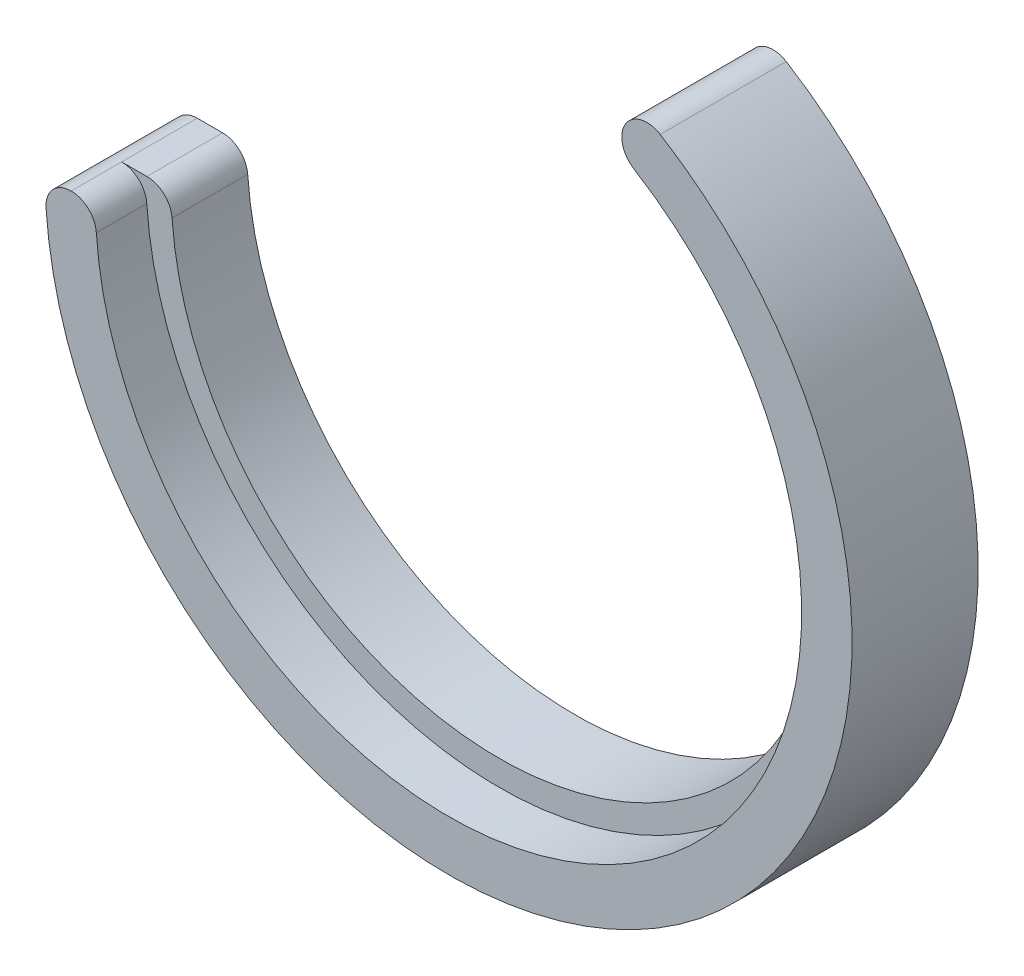
ISO-10303-21;
HEADER;
FILE_DESCRIPTION(('STEP AP214'),'2;1');
FILE_NAME('part.step','',(''),(''),'','','');
FILE_SCHEMA(('AUTOMOTIVE_DESIGN { 1 0 10303 214 1 1 1 1 }'));
ENDSEC;
DATA;
#1=APPLICATION_CONTEXT('core data for automotive mechanical design processes');
#2=APPLICATION_PROTOCOL_DEFINITION('international standard','automotive_design',2000,#1);
#3=PRODUCT_CONTEXT('',#1,'mechanical');
#4=PRODUCT('Part','Part','',(#3));
#5=PRODUCT_RELATED_PRODUCT_CATEGORY('part','',(#4));
#6=PRODUCT_DEFINITION_FORMATION('','',#4);
#7=PRODUCT_DEFINITION_CONTEXT('part definition',#1,'design');
#8=PRODUCT_DEFINITION('design','',#6,#7);
#9=PRODUCT_DEFINITION_SHAPE('','',#8);
#10=(LENGTH_UNIT() NAMED_UNIT(*) SI_UNIT(.MILLI.,.METRE.));
#11=(NAMED_UNIT(*) PLANE_ANGLE_UNIT() SI_UNIT($,.RADIAN.));
#12=(NAMED_UNIT(*) SI_UNIT($,.STERADIAN.) SOLID_ANGLE_UNIT());
#13=UNCERTAINTY_MEASURE_WITH_UNIT(LENGTH_MEASURE(1.E-05),#10,'distance_accuracy_value','');
#14=(GEOMETRIC_REPRESENTATION_CONTEXT(3) GLOBAL_UNCERTAINTY_ASSIGNED_CONTEXT((#13)) GLOBAL_UNIT_ASSIGNED_CONTEXT((#10,
#11,#12)) REPRESENTATION_CONTEXT('',''));
#15=CARTESIAN_POINT('',(0.,0.,0.));
#16=DIRECTION('',(0.,0.,1.));
#17=DIRECTION('',(1.,0.,0.));
#18=AXIS2_PLACEMENT_3D('',#15,#16,#17);
#19=CARTESIAN_POINT('',(0.,0.,1.5));
#20=DIRECTION('',(0.,0.,-1.));
#21=DIRECTION('',(-1.,0.,0.));
#22=AXIS2_PLACEMENT_3D('',#19,#20,#21);
#23=PLANE('',#22);
#24=CARTESIAN_POINT('',(0.,0.,1.5));
#25=DIRECTION('',(0.,0.,-1.));
#26=DIRECTION('',(-1.,0.,0.));
#27=AXIS2_PLACEMENT_3D('',#24,#25,#26);
#28=CIRCLE('',#27,6.5);
#29=CARTESIAN_POINT('',(3.43588156657079,5.51767322886188,1.5));
#30=VERTEX_POINT('',#29);
#31=CARTESIAN_POINT('',(-6.48339716317844,-0.464285714285714,1.5));
#32=VERTEX_POINT('',#31);
#33=EDGE_CURVE('E157',#30,#32,#28,.T.);
#34=ORIENTED_EDGE('',*,*,#33,.T.);
#35=CARTESIAN_POINT('',(-6.98212002188447,-0.5,1.5));
#36=DIRECTION('',(0.,0.,-1.));
#37=DIRECTION('',(-1.,0.,0.));
#38=AXIS2_PLACEMENT_3D('',#35,#36,#37);
#39=CIRCLE('',#38,0.5);
#40=CARTESIAN_POINT('',(-6.98212002188447,0.,1.5));
#41=VERTEX_POINT('',#40);
#42=EDGE_CURVE('E179',#32,#41,#39,.F.);
#43=ORIENTED_EDGE('',*,*,#42,.T.);
#44=DIRECTION('',(-1.,0.,0.));
#45=VECTOR('',#44,1.);
#46=CARTESIAN_POINT('',(-8.,0.,1.5));
#47=LINE('',#46,#45);
#48=CARTESIAN_POINT('',(-7.48331477354788,0.,1.5));
#49=VERTEX_POINT('',#48);
#50=EDGE_CURVE('E138',#41,#49,#47,.T.);
#51=ORIENTED_EDGE('',*,*,#50,.T.);
#52=CARTESIAN_POINT('',(-7.48331477354788,-0.499999999999999,1.5));
#53=DIRECTION('',(0.,0.,-1.));
#54=DIRECTION('',(-1.,0.,0.));
#55=AXIS2_PLACEMENT_3D('',#52,#53,#54);
#56=CIRCLE('',#55,0.5);
#57=CARTESIAN_POINT('',(-6.98442712197803,-0.466666666666666,1.5));
#58=VERTEX_POINT('',#57);
#59=EDGE_CURVE('E42',#49,#58,#56,.T.);
#60=ORIENTED_EDGE('',*,*,#59,.T.);
#61=CARTESIAN_POINT('',(0.,0.,1.5));
#62=DIRECTION('',(0.,0.,-1.));
#63=DIRECTION('',(-1.,0.,0.));
#64=AXIS2_PLACEMENT_3D('',#61,#62,#63);
#65=CIRCLE('',#64,7.);
#66=CARTESIAN_POINT('',(3.67177462252853,5.95970394578082,1.5));
#67=VERTEX_POINT('',#66);
#68=EDGE_CURVE('E170',#67,#58,#65,.T.);
#69=ORIENTED_EDGE('',*,*,#68,.F.);
#70=CARTESIAN_POINT('',(3.93404423842342,6.38539708476517,1.5));
#71=DIRECTION('',(0.,0.,-1.));
#72=DIRECTION('',(-1.,0.,0.));
#73=AXIS2_PLACEMENT_3D('',#70,#71,#72);
#74=CIRCLE('',#73,0.5);
#75=CARTESIAN_POINT('',(3.49181349656916,6.61870368767008,1.5));
#76=VERTEX_POINT('',#75);
#77=EDGE_CURVE('E11',#67,#76,#74,.T.);
#78=ORIENTED_EDGE('',*,*,#77,.T.);
#79=DIRECTION('',(-0.466613205809819,-0.884461483708524,0.));
#80=VECTOR('',#79,1.);
#81=CARTESIAN_POINT('',(3.73290564647855,7.07569186966819,1.5));
#82=LINE('',#81,#80);
#83=CARTESIAN_POINT('',(3.25794940676044,6.17541623398693,1.5));
#84=VERTEX_POINT('',#83);
#85=EDGE_CURVE('E50',#76,#84,#82,.T.);
#86=ORIENTED_EDGE('',*,*,#85,.T.);
#87=CARTESIAN_POINT('',(3.7001801486147,5.94210963108202,1.5));
#88=DIRECTION('',(0.,0.,-1.));
#89=DIRECTION('',(-1.,0.,0.));
#90=AXIS2_PLACEMENT_3D('',#87,#88,#89);
#91=CIRCLE('',#90,0.5);
#92=EDGE_CURVE('E177',#84,#30,#91,.F.);
#93=ORIENTED_EDGE('',*,*,#92,.T.);
#94=EDGE_LOOP('',(#34,#43,#51,#60,#69,#78,#86,#93));
#95=FACE_BOUND('',#94,.T.);
#96=ADVANCED_FACE('F33',(#95),#23,.F.);
#97=CARTESIAN_POINT('',(0.,0.,1.5));
#98=DIRECTION('',(0.,0.,-1.));
#99=DIRECTION('',(-1.,0.,0.));
#100=AXIS2_PLACEMENT_3D('',#97,#98,#99);
#101=CYLINDRICAL_SURFACE('',#100,6.5);
#102=CARTESIAN_POINT('',(0.,0.,0.));
#103=DIRECTION('',(0.,0.,-1.));
#104=DIRECTION('',(-1.,0.,0.));
#105=AXIS2_PLACEMENT_3D('',#102,#103,#104);
#106=CIRCLE('',#105,6.5);
#107=CARTESIAN_POINT('',(3.43588156657079,5.51767322886188,0.));
#108=VERTEX_POINT('',#107);
#109=CARTESIAN_POINT('',(-6.48339716317844,-0.464285714285714,0.));
#110=VERTEX_POINT('',#109);
#111=EDGE_CURVE('E146',#108,#110,#106,.T.);
#112=ORIENTED_EDGE('',*,*,#111,.T.);
#113=DIRECTION('',(0.,0.,-1.));
#114=VECTOR('',#113,1.);
#115=CARTESIAN_POINT('',(-6.48339716317844,-0.464285714285714,1.5));
#116=LINE('',#115,#114);
#117=EDGE_CURVE('E123',#110,#32,#116,.F.);
#118=ORIENTED_EDGE('',*,*,#117,.T.);
#119=ORIENTED_EDGE('',*,*,#33,.F.);
#120=DIRECTION('',(0.,0.,-1.));
#121=VECTOR('',#120,1.);
#122=CARTESIAN_POINT('',(3.43588156657079,5.51767322886188,1.5));
#123=LINE('',#122,#121);
#124=EDGE_CURVE('E128',#30,#108,#123,.T.);
#125=ORIENTED_EDGE('',*,*,#124,.T.);
#126=EDGE_LOOP('',(#112,#118,#119,#125));
#127=FACE_BOUND('',#126,.T.);
#128=ADVANCED_FACE('F228',(#127),#101,.F.);
#129=CARTESIAN_POINT('',(-8.,0.,1.5));
#130=DIRECTION('',(0.,-1.,0.));
#131=DIRECTION('',(1.,0.,0.));
#132=AXIS2_PLACEMENT_3D('',#129,#130,#131);
#133=PLANE('',#132);
#134=ORIENTED_EDGE('',*,*,#50,.F.);
#135=DIRECTION('',(0.,0.,-1.));
#136=VECTOR('',#135,1.);
#137=CARTESIAN_POINT('',(-6.98212002188447,0.,1.5));
#138=LINE('',#137,#136);
#139=CARTESIAN_POINT('',(-6.98212002188447,0.,0.));
#140=VERTEX_POINT('',#139);
#141=EDGE_CURVE('E122',#41,#140,#138,.T.);
#142=ORIENTED_EDGE('',*,*,#141,.T.);
#143=DIRECTION('',(-1.,0.,0.));
#144=VECTOR('',#143,1.);
#145=CARTESIAN_POINT('',(-8.,0.,0.));
#146=LINE('',#145,#144);
#147=CARTESIAN_POINT('',(-7.48331477354788,0.,0.));
#148=VERTEX_POINT('',#147);
#149=EDGE_CURVE('E136',#140,#148,#146,.T.);
#150=ORIENTED_EDGE('',*,*,#149,.T.);
#151=DIRECTION('',(0.,0.,-1.));
#152=VECTOR('',#151,1.);
#153=CARTESIAN_POINT('',(-7.48331477354788,0.,1.5));
#154=LINE('',#153,#152);
#155=EDGE_CURVE('E140',#148,#49,#154,.F.);
#156=ORIENTED_EDGE('',*,*,#155,.T.);
#157=EDGE_LOOP('',(#134,#142,#150,#156));
#158=FACE_BOUND('',#157,.T.);
#159=ADVANCED_FACE('F134',(#158),#133,.F.);
#160=CARTESIAN_POINT('',(0.,0.,1.5));
#161=DIRECTION('',(0.,0.,-1.));
#162=DIRECTION('',(-1.,0.,0.));
#163=AXIS2_PLACEMENT_3D('',#160,#161,#162);
#164=CYLINDRICAL_SURFACE('',#163,8.);
#165=CARTESIAN_POINT('',(0.,0.,2.5));
#166=DIRECTION('',(0.,0.,1.));
#167=DIRECTION('',(-1.,0.,0.));
#168=AXIS2_PLACEMENT_3D('',#165,#166,#167);
#169=CIRCLE('',#168,8.);
#170=CARTESIAN_POINT('',(-7.98220242511774,-0.533333333333333,2.5));
#171=VERTEX_POINT('',#170);
#172=CARTESIAN_POINT('',(4.19631385431831,6.81109022374951,2.5));
#173=VERTEX_POINT('',#172);
#174=EDGE_CURVE('E151',#171,#173,#169,.T.);
#175=ORIENTED_EDGE('',*,*,#174,.F.);
#176=DIRECTION('',(0.,0.,-1.));
#177=VECTOR('',#176,1.);
#178=CARTESIAN_POINT('',(-7.98220242511774,-0.533333333333333,1.5));
#179=LINE('',#178,#177);
#180=CARTESIAN_POINT('',(-7.98220242511774,-0.533333333333333,0.));
#181=VERTEX_POINT('',#180);
#182=EDGE_CURVE('E196',#171,#181,#179,.T.);
#183=ORIENTED_EDGE('',*,*,#182,.T.);
#184=CARTESIAN_POINT('',(0.,0.,0.));
#185=DIRECTION('',(0.,0.,1.));
#186=DIRECTION('',(-1.,0.,0.));
#187=AXIS2_PLACEMENT_3D('',#184,#185,#186);
#188=CIRCLE('',#187,8.);
#189=CARTESIAN_POINT('',(4.19631385431831,6.81109022374951,0.));
#190=VERTEX_POINT('',#189);
#191=EDGE_CURVE('E145',#181,#190,#188,.T.);
#192=ORIENTED_EDGE('',*,*,#191,.T.);
#193=DIRECTION('',(0.,0.,-1.));
#194=VECTOR('',#193,1.);
#195=CARTESIAN_POINT('',(4.19631385431831,6.81109022374951,1.5));
#196=LINE('',#195,#194);
#197=EDGE_CURVE('E194',#190,#173,#196,.F.);
#198=ORIENTED_EDGE('',*,*,#197,.T.);
#199=EDGE_LOOP('',(#175,#183,#192,#198));
#200=FACE_BOUND('',#199,.T.);
#201=ADVANCED_FACE('F250',(#200),#164,.T.);
#202=CARTESIAN_POINT('',(3.73290564647855,7.07569186966819,1.5));
#203=DIRECTION('',(0.884461483708524,-0.466613205809819,0.));
#204=DIRECTION('',(0.466613205809819,0.884461483708524,0.));
#205=AXIS2_PLACEMENT_3D('',#202,#203,#204);
#206=PLANE('',#205);
#207=DIRECTION('',(-0.466613205809819,-0.884461483708524,0.));
#208=VECTOR('',#207,1.);
#209=CARTESIAN_POINT('',(3.73290564647855,7.07569186966819,0.));
#210=LINE('',#209,#208);
#211=CARTESIAN_POINT('',(3.49181349656916,6.61870368767008,0.));
#212=VERTEX_POINT('',#211);
#213=CARTESIAN_POINT('',(3.25794940676044,6.17541623398693,0.));
#214=VERTEX_POINT('',#213);
#215=EDGE_CURVE('E149',#212,#214,#210,.T.);
#216=ORIENTED_EDGE('',*,*,#215,.T.);
#217=DIRECTION('',(0.,0.,-1.));
#218=VECTOR('',#217,1.);
#219=CARTESIAN_POINT('',(3.25794940676044,6.17541623398693,1.5));
#220=LINE('',#219,#218);
#221=EDGE_CURVE('E200',#214,#84,#220,.F.);
#222=ORIENTED_EDGE('',*,*,#221,.T.);
#223=ORIENTED_EDGE('',*,*,#85,.F.);
#224=DIRECTION('',(0.,0.,-1.));
#225=VECTOR('',#224,1.);
#226=CARTESIAN_POINT('',(3.49181349656916,6.61870368767008,1.5));
#227=LINE('',#226,#225);
#228=EDGE_CURVE('E198',#76,#212,#227,.T.);
#229=ORIENTED_EDGE('',*,*,#228,.T.);
#230=EDGE_LOOP('',(#216,#222,#223,#229));
#231=FACE_BOUND('',#230,.T.);
#232=ADVANCED_FACE('F217',(#231),#206,.F.);
#233=CARTESIAN_POINT('',(0.,0.,0.));
#234=DIRECTION('',(0.,0.,-1.));
#235=DIRECTION('',(-1.,0.,0.));
#236=AXIS2_PLACEMENT_3D('',#233,#234,#235);
#237=PLANE('',#236);
#238=ORIENTED_EDGE('',*,*,#149,.F.);
#239=CARTESIAN_POINT('',(-6.98212002188447,-0.5,0.));
#240=DIRECTION('',(0.,0.,-1.));
#241=DIRECTION('',(-1.,0.,0.));
#242=AXIS2_PLACEMENT_3D('',#239,#240,#241);
#243=CIRCLE('',#242,0.5);
#244=EDGE_CURVE('E118',#140,#110,#243,.T.);
#245=ORIENTED_EDGE('',*,*,#244,.T.);
#246=ORIENTED_EDGE('',*,*,#111,.F.);
#247=CARTESIAN_POINT('',(3.7001801486147,5.94210963108202,0.));
#248=DIRECTION('',(0.,0.,-1.));
#249=DIRECTION('',(-1.,0.,0.));
#250=AXIS2_PLACEMENT_3D('',#247,#248,#249);
#251=CIRCLE('',#250,0.5);
#252=EDGE_CURVE('E219',#108,#214,#251,.T.);
#253=ORIENTED_EDGE('',*,*,#252,.T.);
#254=ORIENTED_EDGE('',*,*,#215,.F.);
#255=CARTESIAN_POINT('',(3.93404423842342,6.38539708476517,0.));
#256=DIRECTION('',(0.,0.,-1.));
#257=DIRECTION('',(-1.,0.,0.));
#258=AXIS2_PLACEMENT_3D('',#255,#256,#257);
#259=CIRCLE('',#258,0.5);
#260=EDGE_CURVE('E139',#212,#190,#259,.T.);
#261=ORIENTED_EDGE('',*,*,#260,.T.);
#262=ORIENTED_EDGE('',*,*,#191,.F.);
#263=CARTESIAN_POINT('',(-7.48331477354788,-0.499999999999999,0.));
#264=DIRECTION('',(0.,0.,-1.));
#265=DIRECTION('',(-1.,0.,0.));
#266=AXIS2_PLACEMENT_3D('',#263,#264,#265);
#267=CIRCLE('',#266,0.5);
#268=EDGE_CURVE('E129',#181,#148,#267,.T.);
#269=ORIENTED_EDGE('',*,*,#268,.T.);
#270=EDGE_LOOP('',(#238,#245,#246,#253,#254,#261,#262,#269));
#271=FACE_BOUND('',#270,.T.);
#272=ADVANCED_FACE('F142',(#271),#237,.T.);
#273=CARTESIAN_POINT('',(0.,0.,2.5));
#274=DIRECTION('',(0.,0.,-1.));
#275=DIRECTION('',(-1.,0.,0.));
#276=AXIS2_PLACEMENT_3D('',#273,#274,#275);
#277=CYLINDRICAL_SURFACE('',#276,7.);
#278=ORIENTED_EDGE('',*,*,#68,.T.);
#279=DIRECTION('',(0.,0.,-1.));
#280=VECTOR('',#279,1.);
#281=CARTESIAN_POINT('',(-6.98442712197803,-0.466666666666666,2.5));
#282=LINE('',#281,#280);
#283=CARTESIAN_POINT('',(-6.98442712197803,-0.466666666666666,2.5));
#284=VERTEX_POINT('',#283);
#285=EDGE_CURVE('E184',#58,#284,#282,.F.);
#286=ORIENTED_EDGE('',*,*,#285,.T.);
#287=CARTESIAN_POINT('',(0.,0.,2.5));
#288=DIRECTION('',(0.,0.,-1.));
#289=DIRECTION('',(-1.,0.,0.));
#290=AXIS2_PLACEMENT_3D('',#287,#288,#289);
#291=CIRCLE('',#290,7.);
#292=CARTESIAN_POINT('',(3.67177462252852,5.95970394578082,2.5));
#293=VERTEX_POINT('',#292);
#294=EDGE_CURVE('E174',#293,#284,#291,.T.);
#295=ORIENTED_EDGE('',*,*,#294,.F.);
#296=DIRECTION('',(0.,0.,-1.));
#297=VECTOR('',#296,1.);
#298=CARTESIAN_POINT('',(3.67177462252853,5.95970394578082,2.5));
#299=LINE('',#298,#297);
#300=EDGE_CURVE('E181',#293,#67,#299,.T.);
#301=ORIENTED_EDGE('',*,*,#300,.T.);
#302=EDGE_LOOP('',(#278,#286,#295,#301));
#303=FACE_BOUND('',#302,.T.);
#304=ADVANCED_FACE('F244',(#303),#277,.F.);
#305=CARTESIAN_POINT('',(0.,0.,2.5));
#306=DIRECTION('',(0.,0.,-1.));
#307=DIRECTION('',(-1.,0.,0.));
#308=AXIS2_PLACEMENT_3D('',#305,#306,#307);
#309=PLANE('',#308);
#310=ORIENTED_EDGE('',*,*,#294,.T.);
#311=CARTESIAN_POINT('',(-7.48331477354788,-0.499999999999999,2.5));
#312=DIRECTION('',(0.,0.,-1.));
#313=DIRECTION('',(-1.,0.,0.));
#314=AXIS2_PLACEMENT_3D('',#311,#312,#313);
#315=CIRCLE('',#314,0.5);
#316=CARTESIAN_POINT('',(-7.48331477354788,0.,2.5));
#317=VERTEX_POINT('',#316);
#318=EDGE_CURVE('E192',#284,#317,#315,.F.);
#319=ORIENTED_EDGE('',*,*,#318,.T.);
#320=CARTESIAN_POINT('',(-7.48331477354788,-0.499999999999999,2.5));
#321=DIRECTION('',(0.,0.,-1.));
#322=DIRECTION('',(-1.,0.,0.));
#323=AXIS2_PLACEMENT_3D('',#320,#321,#322);
#324=CIRCLE('',#323,0.5);
#325=EDGE_CURVE('E190',#317,#171,#324,.F.);
#326=ORIENTED_EDGE('',*,*,#325,.T.);
#327=ORIENTED_EDGE('',*,*,#174,.T.);
#328=CARTESIAN_POINT('',(3.93404423842342,6.38539708476517,2.5));
#329=DIRECTION('',(0.,0.,-1.));
#330=DIRECTION('',(-1.,0.,0.));
#331=AXIS2_PLACEMENT_3D('',#328,#329,#330);
#332=CIRCLE('',#331,0.5);
#333=CARTESIAN_POINT('',(3.49181349656916,6.61870368767008,2.5));
#334=VERTEX_POINT('',#333);
#335=EDGE_CURVE('E57',#173,#334,#332,.F.);
#336=ORIENTED_EDGE('',*,*,#335,.T.);
#337=CARTESIAN_POINT('',(3.93404423842342,6.38539708476517,2.5));
#338=DIRECTION('',(0.,0.,-1.));
#339=DIRECTION('',(-1.,0.,0.));
#340=AXIS2_PLACEMENT_3D('',#337,#338,#339);
#341=CIRCLE('',#340,0.5);
#342=EDGE_CURVE('E188',#334,#293,#341,.F.);
#343=ORIENTED_EDGE('',*,*,#342,.T.);
#344=EDGE_LOOP('',(#310,#319,#326,#327,#336,#343));
#345=FACE_BOUND('',#344,.T.);
#346=ADVANCED_FACE('F259',(#345),#309,.F.);
#347=CARTESIAN_POINT('',(-6.98212002188447,-0.5,1.5));
#348=DIRECTION('',(0.,0.,-1.));
#349=DIRECTION('',(-1.,0.,0.));
#350=AXIS2_PLACEMENT_3D('',#347,#348,#349);
#351=CYLINDRICAL_SURFACE('',#350,0.5);
#352=ORIENTED_EDGE('',*,*,#42,.F.);
#353=ORIENTED_EDGE('',*,*,#117,.F.);
#354=ORIENTED_EDGE('',*,*,#244,.F.);
#355=ORIENTED_EDGE('',*,*,#141,.F.);
#356=EDGE_LOOP('',(#352,#353,#354,#355));
#357=FACE_BOUND('',#356,.T.);
#358=ADVANCED_FACE('F121',(#357),#351,.T.);
#359=CARTESIAN_POINT('',(-7.48331477354788,-0.499999999999999,1.5));
#360=DIRECTION('',(0.,0.,-1.));
#361=DIRECTION('',(-1.,0.,0.));
#362=AXIS2_PLACEMENT_3D('',#359,#360,#361);
#363=CYLINDRICAL_SURFACE('',#362,0.5);
#364=ORIENTED_EDGE('',*,*,#182,.F.);
#365=ORIENTED_EDGE('',*,*,#325,.F.);
#366=DIRECTION('',(0.,0.,-1.));
#367=VECTOR('',#366,1.);
#368=CARTESIAN_POINT('',(-7.48331477354788,0.,1.5));
#369=LINE('',#368,#367);
#370=EDGE_CURVE('E175',#49,#317,#369,.F.);
#371=ORIENTED_EDGE('',*,*,#370,.F.);
#372=ORIENTED_EDGE('',*,*,#155,.F.);
#373=ORIENTED_EDGE('',*,*,#268,.F.);
#374=EDGE_LOOP('',(#364,#365,#371,#372,#373));
#375=FACE_BOUND('',#374,.T.);
#376=ADVANCED_FACE('F258',(#375),#363,.T.);
#377=CARTESIAN_POINT('',(-7.48331477354788,-0.499999999999999,2.5));
#378=DIRECTION('',(0.,0.,-1.));
#379=DIRECTION('',(-1.,0.,0.));
#380=AXIS2_PLACEMENT_3D('',#377,#378,#379);
#381=CYLINDRICAL_SURFACE('',#380,0.5);
#382=ORIENTED_EDGE('',*,*,#318,.F.);
#383=ORIENTED_EDGE('',*,*,#285,.F.);
#384=ORIENTED_EDGE('',*,*,#59,.F.);
#385=ORIENTED_EDGE('',*,*,#370,.T.);
#386=EDGE_LOOP('',(#382,#383,#384,#385));
#387=FACE_BOUND('',#386,.T.);
#388=ADVANCED_FACE('F260',(#387),#381,.T.);
#389=CARTESIAN_POINT('',(3.93404423842342,6.38539708476517,1.5));
#390=DIRECTION('',(0.,0.,-1.));
#391=DIRECTION('',(-1.,0.,0.));
#392=AXIS2_PLACEMENT_3D('',#389,#390,#391);
#393=CYLINDRICAL_SURFACE('',#392,0.5);
#394=DIRECTION('',(0.,0.,-1.));
#395=VECTOR('',#394,1.);
#396=CARTESIAN_POINT('',(3.49181349656916,6.61870368767008,1.5));
#397=LINE('',#396,#395);
#398=EDGE_CURVE('E37',#334,#76,#397,.T.);
#399=ORIENTED_EDGE('',*,*,#398,.F.);
#400=ORIENTED_EDGE('',*,*,#335,.F.);
#401=ORIENTED_EDGE('',*,*,#197,.F.);
#402=ORIENTED_EDGE('',*,*,#260,.F.);
#403=ORIENTED_EDGE('',*,*,#228,.F.);
#404=EDGE_LOOP('',(#399,#400,#401,#402,#403));
#405=FACE_BOUND('',#404,.T.);
#406=ADVANCED_FACE('F213',(#405),#393,.T.);
#407=CARTESIAN_POINT('',(3.93404423842342,6.38539708476517,2.5));
#408=DIRECTION('',(0.,0.,-1.));
#409=DIRECTION('',(-1.,0.,0.));
#410=AXIS2_PLACEMENT_3D('',#407,#408,#409);
#411=CYLINDRICAL_SURFACE('',#410,0.5);
#412=ORIENTED_EDGE('',*,*,#342,.F.);
#413=ORIENTED_EDGE('',*,*,#398,.T.);
#414=ORIENTED_EDGE('',*,*,#77,.F.);
#415=ORIENTED_EDGE('',*,*,#300,.F.);
#416=EDGE_LOOP('',(#412,#413,#414,#415));
#417=FACE_BOUND('',#416,.T.);
#418=ADVANCED_FACE('F209',(#417),#411,.T.);
#419=CARTESIAN_POINT('',(3.7001801486147,5.94210963108202,1.5));
#420=DIRECTION('',(0.,0.,-1.));
#421=DIRECTION('',(-1.,0.,0.));
#422=AXIS2_PLACEMENT_3D('',#419,#420,#421);
#423=CYLINDRICAL_SURFACE('',#422,0.5);
#424=ORIENTED_EDGE('',*,*,#92,.F.);
#425=ORIENTED_EDGE('',*,*,#221,.F.);
#426=ORIENTED_EDGE('',*,*,#252,.F.);
#427=ORIENTED_EDGE('',*,*,#124,.F.);
#428=EDGE_LOOP('',(#424,#425,#426,#427));
#429=FACE_BOUND('',#428,.T.);
#430=ADVANCED_FACE('F35',(#429),#423,.T.);
#431=CLOSED_SHELL('',(#96,#128,#159,#201,#232,#272,#304,#346,#358,#376,#388,#406,#418,#430));
#432=MANIFOLD_SOLID_BREP('B2',#431);
#433=ADVANCED_BREP_SHAPE_REPRESENTATION('',(#18,#432),#14);
#434=SHAPE_DEFINITION_REPRESENTATION(#9,#433);
ENDSEC;
END-ISO-10303-21;
